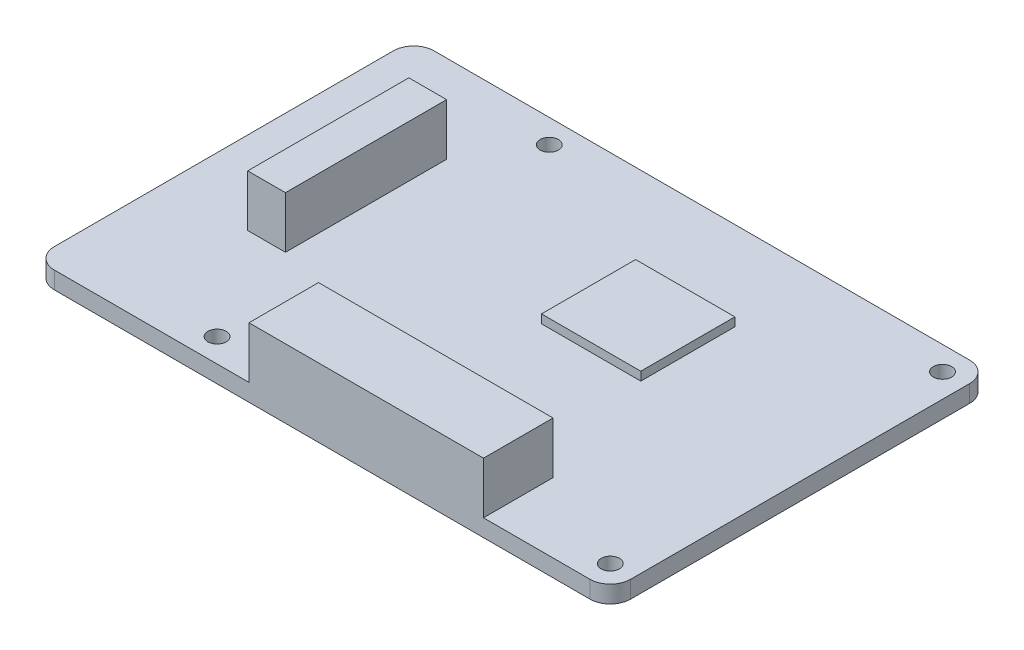
ISO-10303-21;
HEADER;
FILE_DESCRIPTION(('STEP AP214'),'2;1');
FILE_NAME('part.step','',(''),(''),'','','');
FILE_SCHEMA(('AUTOMOTIVE_DESIGN { 1 0 10303 214 1 1 1 1 }'));
ENDSEC;
DATA;
#1=APPLICATION_CONTEXT('core data for automotive mechanical design processes');
#2=APPLICATION_PROTOCOL_DEFINITION('international standard','automotive_design',2000,#1);
#3=PRODUCT_CONTEXT('',#1,'mechanical');
#4=PRODUCT('Part','Part','',(#3));
#5=PRODUCT_RELATED_PRODUCT_CATEGORY('part','',(#4));
#6=PRODUCT_DEFINITION_FORMATION('','',#4);
#7=PRODUCT_DEFINITION_CONTEXT('part definition',#1,'design');
#8=PRODUCT_DEFINITION('design','',#6,#7);
#9=PRODUCT_DEFINITION_SHAPE('','',#8);
#10=(LENGTH_UNIT() NAMED_UNIT(*) SI_UNIT(.MILLI.,.METRE.));
#11=(NAMED_UNIT(*) PLANE_ANGLE_UNIT() SI_UNIT($,.RADIAN.));
#12=(NAMED_UNIT(*) SI_UNIT($,.STERADIAN.) SOLID_ANGLE_UNIT());
#13=UNCERTAINTY_MEASURE_WITH_UNIT(LENGTH_MEASURE(1.E-05),#10,'distance_accuracy_value','');
#14=(GEOMETRIC_REPRESENTATION_CONTEXT(3) GLOBAL_UNCERTAINTY_ASSIGNED_CONTEXT((#13)) GLOBAL_UNIT_ASSIGNED_CONTEXT((#10,
#11,#12)) REPRESENTATION_CONTEXT('',''));
#15=CARTESIAN_POINT('',(0.,0.,0.));
#16=DIRECTION('',(0.,0.,1.));
#17=DIRECTION('',(1.,0.,0.));
#18=AXIS2_PLACEMENT_3D('',#15,#16,#17);
#19=CARTESIAN_POINT('',(0.,2.54,0.));
#20=DIRECTION('',(0.,1.,0.));
#21=DIRECTION('',(0.,0.,1.));
#22=AXIS2_PLACEMENT_3D('',#19,#20,#21);
#23=PLANE('',#22);
#24=DIRECTION('',(0.,0.,1.));
#25=VECTOR('',#24,1.);
#26=CARTESIAN_POINT('',(-10.7962541657116,2.54,17.7403283003059));
#27=LINE('',#26,#25);
#28=CARTESIAN_POINT('',(-10.7962541657116,2.54,17.7403283003059));
#29=VERTEX_POINT('',#28);
#30=CARTESIAN_POINT('',(-10.7962541657116,2.54,28.0000000000008));
#31=VERTEX_POINT('',#30);
#32=EDGE_CURVE('E230',#29,#31,#27,.T.);
#33=ORIENTED_EDGE('',*,*,#32,.F.);
#34=DIRECTION('',(-1.,0.,0.));
#35=VECTOR('',#34,1.);
#36=CARTESIAN_POINT('',(-10.7962541657116,2.54,17.7403283003059));
#37=LINE('',#36,#35);
#38=CARTESIAN_POINT('',(23.7946042341264,2.54,17.7403283003059));
#39=VERTEX_POINT('',#38);
#40=EDGE_CURVE('E235',#39,#29,#37,.T.);
#41=ORIENTED_EDGE('',*,*,#40,.F.);
#42=DIRECTION('',(0.,0.,-1.));
#43=VECTOR('',#42,1.);
#44=CARTESIAN_POINT('',(23.7946042341264,2.54,17.7403283003059));
#45=LINE('',#44,#43);
#46=CARTESIAN_POINT('',(23.7946042341264,2.54,28.0000000000008));
#47=VERTEX_POINT('',#46);
#48=EDGE_CURVE('E244',#47,#39,#45,.T.);
#49=ORIENTED_EDGE('',*,*,#48,.F.);
#50=DIRECTION('',(1.,0.,0.));
#51=VECTOR('',#50,1.);
#52=CARTESIAN_POINT('',(0.,2.54,28.0000000000008));
#53=LINE('',#52,#51);
#54=CARTESIAN_POINT('',(39.5000022412256,2.54,28.0000000000008));
#55=VERTEX_POINT('',#54);
#56=EDGE_CURVE('E264',#47,#55,#53,.T.);
#57=ORIENTED_EDGE('',*,*,#56,.T.);
#58=CARTESIAN_POINT('',(39.5000022412256,2.54,25.0000022412256));
#59=DIRECTION('',(0.,1.,0.));
#60=DIRECTION('',(0.,0.,1.));
#61=AXIS2_PLACEMENT_3D('',#58,#59,#60);
#62=CIRCLE('',#61,2.99999775877525);
#63=CARTESIAN_POINT('',(42.5000000000008,2.54,25.0000022412256));
#64=VERTEX_POINT('',#63);
#65=EDGE_CURVE('E268',#55,#64,#62,.T.);
#66=ORIENTED_EDGE('',*,*,#65,.T.);
#67=DIRECTION('',(0.,0.,-1.));
#68=VECTOR('',#67,1.);
#69=CARTESIAN_POINT('',(42.5000000000008,2.54,0.));
#70=LINE('',#69,#68);
#71=CARTESIAN_POINT('',(42.5000000000008,2.54,-25.0000022412256));
#72=VERTEX_POINT('',#71);
#73=EDGE_CURVE('E270',#64,#72,#70,.T.);
#74=ORIENTED_EDGE('',*,*,#73,.T.);
#75=CARTESIAN_POINT('',(39.5000022412256,2.54,-25.0000022412256));
#76=DIRECTION('',(0.,1.,0.));
#77=DIRECTION('',(0.,0.,1.));
#78=AXIS2_PLACEMENT_3D('',#75,#76,#77);
#79=CIRCLE('',#78,2.99999775877525);
#80=CARTESIAN_POINT('',(39.5000022412256,2.54,-28.0000000000008));
#81=VERTEX_POINT('',#80);
#82=EDGE_CURVE('E272',#72,#81,#79,.T.);
#83=ORIENTED_EDGE('',*,*,#82,.T.);
#84=DIRECTION('',(-1.,0.,0.));
#85=VECTOR('',#84,1.);
#86=CARTESIAN_POINT('',(0.,2.54,-28.0000000000008));
#87=LINE('',#86,#85);
#88=CARTESIAN_POINT('',(-39.5000022412248,2.54,-28.0000000000008));
#89=VERTEX_POINT('',#88);
#90=EDGE_CURVE('E274',#81,#89,#87,.T.);
#91=ORIENTED_EDGE('',*,*,#90,.T.);
#92=CARTESIAN_POINT('',(-39.5000022412256,2.54,-25.0000022412256));
#93=DIRECTION('',(0.,1.,0.));
#94=DIRECTION('',(0.,0.,1.));
#95=AXIS2_PLACEMENT_3D('',#92,#93,#94);
#96=CIRCLE('',#95,2.99999775877482);
#97=CARTESIAN_POINT('',(-42.5,2.54,-25.0000022412256));
#98=VERTEX_POINT('',#97);
#99=EDGE_CURVE('E276',#89,#98,#96,.T.);
#100=ORIENTED_EDGE('',*,*,#99,.T.);
#101=DIRECTION('',(0.,0.,1.));
#102=VECTOR('',#101,1.);
#103=CARTESIAN_POINT('',(-42.5,2.54,0.));
#104=LINE('',#103,#102);
#105=CARTESIAN_POINT('',(-42.5,2.54,25.0000022412256));
#106=VERTEX_POINT('',#105);
#107=EDGE_CURVE('E278',#98,#106,#104,.T.);
#108=ORIENTED_EDGE('',*,*,#107,.T.);
#109=CARTESIAN_POINT('',(-39.5000022412256,2.54,25.0000022412256));
#110=DIRECTION('',(0.,1.,0.));
#111=DIRECTION('',(0.,0.,1.));
#112=AXIS2_PLACEMENT_3D('',#109,#110,#111);
#113=CIRCLE('',#112,2.99999775877482);
#114=CARTESIAN_POINT('',(-39.5000022412247,2.54,28.0000000000008));
#115=VERTEX_POINT('',#114);
#116=EDGE_CURVE('E280',#106,#115,#113,.T.);
#117=ORIENTED_EDGE('',*,*,#116,.T.);
#118=EDGE_CURVE('E266',#115,#31,#53,.T.);
#119=ORIENTED_EDGE('',*,*,#118,.T.);
#120=EDGE_LOOP('',(#33,#41,#49,#57,#66,#74,#83,#91,#100,#108,#117,#119));
#121=FACE_BOUND('',#120,.T.);
#122=CARTESIAN_POINT('',(-19.,2.54,24.5));
#123=DIRECTION('',(0.,1.,0.));
#124=DIRECTION('',(0.,0.,1.));
#125=AXIS2_PLACEMENT_3D('',#122,#123,#124);
#126=CIRCLE('',#125,1.35);
#127=CARTESIAN_POINT('',(-19.,2.54,25.85));
#128=VERTEX_POINT('',#127);
#129=EDGE_CURVE('E261',#128,#128,#126,.T.);
#130=ORIENTED_EDGE('',*,*,#129,.F.);
#131=EDGE_LOOP('',(#130));
#132=FACE_BOUND('',#131,.T.);
#133=CARTESIAN_POINT('',(39.,2.54,24.5));
#134=DIRECTION('',(0.,1.,0.));
#135=DIRECTION('',(0.,0.,1.));
#136=AXIS2_PLACEMENT_3D('',#133,#134,#135);
#137=CIRCLE('',#136,1.35000000000001);
#138=CARTESIAN_POINT('',(39.,2.54,25.85));
#139=VERTEX_POINT('',#138);
#140=EDGE_CURVE('E282',#139,#139,#137,.T.);
#141=ORIENTED_EDGE('',*,*,#140,.F.);
#142=EDGE_LOOP('',(#141));
#143=FACE_BOUND('',#142,.T.);
#144=CARTESIAN_POINT('',(-19.,2.54,-24.5));
#145=DIRECTION('',(0.,1.,0.));
#146=DIRECTION('',(0.,0.,1.));
#147=AXIS2_PLACEMENT_3D('',#144,#145,#146);
#148=CIRCLE('',#147,1.35);
#149=CARTESIAN_POINT('',(-19.,2.54,-23.15));
#150=VERTEX_POINT('',#149);
#151=EDGE_CURVE('E285',#150,#150,#148,.T.);
#152=ORIENTED_EDGE('',*,*,#151,.F.);
#153=EDGE_LOOP('',(#152));
#154=FACE_BOUND('',#153,.T.);
#155=CARTESIAN_POINT('',(39.,2.54,-24.5));
#156=DIRECTION('',(0.,1.,0.));
#157=DIRECTION('',(0.,0.,1.));
#158=AXIS2_PLACEMENT_3D('',#155,#156,#157);
#159=CIRCLE('',#158,1.35);
#160=CARTESIAN_POINT('',(39.,2.54,-23.15));
#161=VERTEX_POINT('',#160);
#162=EDGE_CURVE('E288',#161,#161,#159,.T.);
#163=ORIENTED_EDGE('',*,*,#162,.F.);
#164=EDGE_LOOP('',(#163));
#165=FACE_BOUND('',#164,.T.);
#166=DIRECTION('',(-1.,0.,0.));
#167=VECTOR('',#166,1.);
#168=CARTESIAN_POINT('',(-24.7209516078613,2.54,-15.0780354516087));
#169=LINE('',#168,#167);
#170=CARTESIAN_POINT('',(-24.7209516078613,2.54,-15.0780354516087));
#171=VERTEX_POINT('',#170);
#172=CARTESIAN_POINT('',(-30.2919367403547,2.54,-15.0780354516087));
#173=VERTEX_POINT('',#172);
#174=EDGE_CURVE('E202',#171,#173,#169,.T.);
#175=ORIENTED_EDGE('',*,*,#174,.F.);
#176=DIRECTION('',(0.,0.,-1.));
#177=VECTOR('',#176,1.);
#178=CARTESIAN_POINT('',(-24.7209516078613,2.54,-15.0780354516087));
#179=LINE('',#178,#177);
#180=CARTESIAN_POINT('',(-24.7209516078613,2.54,8.69120809727519));
#181=VERTEX_POINT('',#180);
#182=EDGE_CURVE('E199',#181,#171,#179,.T.);
#183=ORIENTED_EDGE('',*,*,#182,.F.);
#184=DIRECTION('',(1.,0.,0.));
#185=VECTOR('',#184,1.);
#186=CARTESIAN_POINT('',(-24.7209516078613,2.54,8.69120809727519));
#187=LINE('',#186,#185);
#188=CARTESIAN_POINT('',(-30.2919367403547,2.54,8.69120809727519));
#189=VERTEX_POINT('',#188);
#190=EDGE_CURVE('E211',#189,#181,#187,.T.);
#191=ORIENTED_EDGE('',*,*,#190,.F.);
#192=DIRECTION('',(0.,0.,1.));
#193=VECTOR('',#192,1.);
#194=CARTESIAN_POINT('',(-30.2919367403547,2.54,-15.0780354516087));
#195=LINE('',#194,#193);
#196=EDGE_CURVE('E219',#173,#189,#195,.T.);
#197=ORIENTED_EDGE('',*,*,#196,.F.);
#198=EDGE_LOOP('',(#175,#183,#191,#197));
#199=FACE_BOUND('',#198,.T.);
#200=DIRECTION('',(1.,0.,0.));
#201=VECTOR('',#200,1.);
#202=CARTESIAN_POINT('',(3.29664816990771,2.54,-1.05752520516944));
#203=LINE('',#202,#201);
#204=CARTESIAN_POINT('',(3.29664816990771,2.54,-1.05752520516944));
#205=VERTEX_POINT('',#204);
#206=CARTESIAN_POINT('',(17.9361310381978,2.54,-1.05752520516944));
#207=VERTEX_POINT('',#206);
#208=EDGE_CURVE('E436',#205,#207,#203,.T.);
#209=ORIENTED_EDGE('',*,*,#208,.F.);
#210=DIRECTION('',(0.,0.,1.));
#211=VECTOR('',#210,1.);
#212=CARTESIAN_POINT('',(3.29664816990771,2.54,-14.9369410089548));
#213=LINE('',#212,#211);
#214=CARTESIAN_POINT('',(3.29664816990771,2.54,-14.9369410089548));
#215=VERTEX_POINT('',#214);
#216=EDGE_CURVE('E197',#215,#205,#213,.T.);
#217=ORIENTED_EDGE('',*,*,#216,.F.);
#218=DIRECTION('',(-1.,0.,0.));
#219=VECTOR('',#218,1.);
#220=CARTESIAN_POINT('',(3.29664816990771,2.54,-14.9369410089548));
#221=LINE('',#220,#219);
#222=CARTESIAN_POINT('',(17.9361310381978,2.54,-14.9369410089548));
#223=VERTEX_POINT('',#222);
#224=EDGE_CURVE('E193',#223,#215,#221,.T.);
#225=ORIENTED_EDGE('',*,*,#224,.F.);
#226=DIRECTION('',(0.,0.,-1.));
#227=VECTOR('',#226,1.);
#228=CARTESIAN_POINT('',(17.9361310381978,2.54,-14.9369410089548));
#229=LINE('',#228,#227);
#230=EDGE_CURVE('E438',#207,#223,#229,.T.);
#231=ORIENTED_EDGE('',*,*,#230,.F.);
#232=EDGE_LOOP('',(#209,#217,#225,#231));
#233=FACE_BOUND('',#232,.T.);
#234=ADVANCED_FACE('F36',(#121,#132,#143,#154,#165,#199,#233),#23,.T.);
#235=CARTESIAN_POINT('',(0.,2.54,28.0000000000008));
#236=DIRECTION('',(0.,0.,-1.));
#237=DIRECTION('',(-1.,0.,0.));
#238=AXIS2_PLACEMENT_3D('',#235,#236,#237);
#239=PLANE('',#238);
#240=DIRECTION('',(1.,0.,0.));
#241=VECTOR('',#240,1.);
#242=CARTESIAN_POINT('',(0.,0.,28.0000000000008));
#243=LINE('',#242,#241);
#244=CARTESIAN_POINT('',(-39.5000022412247,0.,28.0000000000008));
#245=VERTEX_POINT('',#244);
#246=CARTESIAN_POINT('',(39.5000022412256,0.,28.0000000000008));
#247=VERTEX_POINT('',#246);
#248=EDGE_CURVE('E294',#245,#247,#243,.T.);
#249=ORIENTED_EDGE('',*,*,#248,.T.);
#250=DIRECTION('',(0.,-1.,0.));
#251=VECTOR('',#250,1.);
#252=CARTESIAN_POINT('',(39.5000022412256,2.54,28.0000000000008));
#253=LINE('',#252,#251);
#254=EDGE_CURVE('E11',#55,#247,#253,.T.);
#255=ORIENTED_EDGE('',*,*,#254,.F.);
#256=ORIENTED_EDGE('',*,*,#56,.F.);
#257=DIRECTION('',(0.,-1.,0.));
#258=VECTOR('',#257,1.);
#259=CARTESIAN_POINT('',(23.7946042341264,10.16,28.0000000000008));
#260=LINE('',#259,#258);
#261=CARTESIAN_POINT('',(23.7946042341264,10.16,28.0000000000008));
#262=VERTEX_POINT('',#261);
#263=EDGE_CURVE('E254',#262,#47,#260,.T.);
#264=ORIENTED_EDGE('',*,*,#263,.F.);
#265=DIRECTION('',(1.,0.,0.));
#266=VECTOR('',#265,1.);
#267=CARTESIAN_POINT('',(-10.7962541657116,10.16,28.0000000000008));
#268=LINE('',#267,#266);
#269=CARTESIAN_POINT('',(-10.7962541657116,10.16,28.0000000000008));
#270=VERTEX_POINT('',#269);
#271=EDGE_CURVE('E234',#270,#262,#268,.T.);
#272=ORIENTED_EDGE('',*,*,#271,.F.);
#273=DIRECTION('',(0.,-1.,0.));
#274=VECTOR('',#273,1.);
#275=CARTESIAN_POINT('',(-10.7962541657116,10.16,28.0000000000008));
#276=LINE('',#275,#274);
#277=EDGE_CURVE('E257',#270,#31,#276,.T.);
#278=ORIENTED_EDGE('',*,*,#277,.T.);
#279=ORIENTED_EDGE('',*,*,#118,.F.);
#280=DIRECTION('',(0.,-1.,0.));
#281=VECTOR('',#280,1.);
#282=CARTESIAN_POINT('',(-39.5000022412247,2.54,28.0000000000008));
#283=LINE('',#282,#281);
#284=EDGE_CURVE('E291',#115,#245,#283,.T.);
#285=ORIENTED_EDGE('',*,*,#284,.T.);
#286=EDGE_LOOP('',(#249,#255,#256,#264,#272,#278,#279,#285));
#287=FACE_BOUND('',#286,.T.);
#288=ADVANCED_FACE('F367',(#287),#239,.F.);
#289=CARTESIAN_POINT('',(39.5000022412256,2.54,25.0000022412256));
#290=DIRECTION('',(0.,-1.,0.));
#291=DIRECTION('',(0.,0.,-1.));
#292=AXIS2_PLACEMENT_3D('',#289,#290,#291);
#293=CYLINDRICAL_SURFACE('',#292,2.99999775877525);
#294=CARTESIAN_POINT('',(39.5000022412256,0.,25.0000022412256));
#295=DIRECTION('',(0.,1.,0.));
#296=DIRECTION('',(0.,0.,1.));
#297=AXIS2_PLACEMENT_3D('',#294,#295,#296);
#298=CIRCLE('',#297,2.99999775877525);
#299=CARTESIAN_POINT('',(42.5000000000008,0.,25.0000022412256));
#300=VERTEX_POINT('',#299);
#301=EDGE_CURVE('E297',#247,#300,#298,.T.);
#302=ORIENTED_EDGE('',*,*,#301,.T.);
#303=DIRECTION('',(0.,-1.,0.));
#304=VECTOR('',#303,1.);
#305=CARTESIAN_POINT('',(42.5000000000008,2.54,25.0000022412256));
#306=LINE('',#305,#304);
#307=EDGE_CURVE('E44',#64,#300,#306,.T.);
#308=ORIENTED_EDGE('',*,*,#307,.F.);
#309=ORIENTED_EDGE('',*,*,#65,.F.);
#310=ORIENTED_EDGE('',*,*,#254,.T.);
#311=EDGE_LOOP('',(#302,#308,#309,#310));
#312=FACE_BOUND('',#311,.T.);
#313=ADVANCED_FACE('F365',(#312),#293,.T.);
#314=CARTESIAN_POINT('',(42.5000000000008,2.54,0.));
#315=DIRECTION('',(-1.,0.,0.));
#316=DIRECTION('',(0.,0.,1.));
#317=AXIS2_PLACEMENT_3D('',#314,#315,#316);
#318=PLANE('',#317);
#319=DIRECTION('',(0.,0.,-1.));
#320=VECTOR('',#319,1.);
#321=CARTESIAN_POINT('',(42.5000000000008,0.,0.));
#322=LINE('',#321,#320);
#323=CARTESIAN_POINT('',(42.5000000000008,0.,-25.0000022412256));
#324=VERTEX_POINT('',#323);
#325=EDGE_CURVE('E299',#300,#324,#322,.T.);
#326=ORIENTED_EDGE('',*,*,#325,.T.);
#327=DIRECTION('',(0.,-1.,0.));
#328=VECTOR('',#327,1.);
#329=CARTESIAN_POINT('',(42.5000000000008,2.54,-25.0000022412256));
#330=LINE('',#329,#328);
#331=EDGE_CURVE('E333',#72,#324,#330,.T.);
#332=ORIENTED_EDGE('',*,*,#331,.F.);
#333=ORIENTED_EDGE('',*,*,#73,.F.);
#334=ORIENTED_EDGE('',*,*,#307,.T.);
#335=EDGE_LOOP('',(#326,#332,#333,#334));
#336=FACE_BOUND('',#335,.T.);
#337=ADVANCED_FACE('F340',(#336),#318,.F.);
#338=CARTESIAN_POINT('',(39.5000022412256,2.54,-25.0000022412256));
#339=DIRECTION('',(0.,-1.,0.));
#340=DIRECTION('',(0.,0.,-1.));
#341=AXIS2_PLACEMENT_3D('',#338,#339,#340);
#342=CYLINDRICAL_SURFACE('',#341,2.99999775877525);
#343=CARTESIAN_POINT('',(39.5000022412256,0.,-25.0000022412256));
#344=DIRECTION('',(0.,1.,0.));
#345=DIRECTION('',(0.,0.,1.));
#346=AXIS2_PLACEMENT_3D('',#343,#344,#345);
#347=CIRCLE('',#346,2.99999775877525);
#348=CARTESIAN_POINT('',(39.5000022412256,0.,-28.0000000000008));
#349=VERTEX_POINT('',#348);
#350=EDGE_CURVE('E301',#324,#349,#347,.T.);
#351=ORIENTED_EDGE('',*,*,#350,.T.);
#352=DIRECTION('',(0.,-1.,0.));
#353=VECTOR('',#352,1.);
#354=CARTESIAN_POINT('',(39.5000022412256,2.54,-28.0000000000008));
#355=LINE('',#354,#353);
#356=EDGE_CURVE('E330',#81,#349,#355,.T.);
#357=ORIENTED_EDGE('',*,*,#356,.F.);
#358=ORIENTED_EDGE('',*,*,#82,.F.);
#359=ORIENTED_EDGE('',*,*,#331,.T.);
#360=EDGE_LOOP('',(#351,#357,#358,#359));
#361=FACE_BOUND('',#360,.T.);
#362=ADVANCED_FACE('F353',(#361),#342,.T.);
#363=CARTESIAN_POINT('',(0.,2.54,-28.0000000000008));
#364=DIRECTION('',(0.,0.,1.));
#365=DIRECTION('',(1.,0.,0.));
#366=AXIS2_PLACEMENT_3D('',#363,#364,#365);
#367=PLANE('',#366);
#368=DIRECTION('',(-1.,0.,0.));
#369=VECTOR('',#368,1.);
#370=CARTESIAN_POINT('',(0.,0.,-28.0000000000008));
#371=LINE('',#370,#369);
#372=CARTESIAN_POINT('',(-39.5000022412248,0.,-28.0000000000008));
#373=VERTEX_POINT('',#372);
#374=EDGE_CURVE('E303',#349,#373,#371,.T.);
#375=ORIENTED_EDGE('',*,*,#374,.T.);
#376=DIRECTION('',(0.,-1.,0.));
#377=VECTOR('',#376,1.);
#378=CARTESIAN_POINT('',(-39.5000022412248,2.54,-28.0000000000008));
#379=LINE('',#378,#377);
#380=EDGE_CURVE('E327',#89,#373,#379,.T.);
#381=ORIENTED_EDGE('',*,*,#380,.F.);
#382=ORIENTED_EDGE('',*,*,#90,.F.);
#383=ORIENTED_EDGE('',*,*,#356,.T.);
#384=EDGE_LOOP('',(#375,#381,#382,#383));
#385=FACE_BOUND('',#384,.T.);
#386=ADVANCED_FACE('F357',(#385),#367,.F.);
#387=CARTESIAN_POINT('',(-39.5000022412256,2.54,-25.0000022412256));
#388=DIRECTION('',(0.,-1.,0.));
#389=DIRECTION('',(0.,0.,-1.));
#390=AXIS2_PLACEMENT_3D('',#387,#388,#389);
#391=CYLINDRICAL_SURFACE('',#390,2.99999775877482);
#392=CARTESIAN_POINT('',(-39.5000022412256,0.,-25.0000022412256));
#393=DIRECTION('',(0.,1.,0.));
#394=DIRECTION('',(0.,0.,1.));
#395=AXIS2_PLACEMENT_3D('',#392,#393,#394);
#396=CIRCLE('',#395,2.99999775877482);
#397=CARTESIAN_POINT('',(-42.5,0.,-25.0000022412256));
#398=VERTEX_POINT('',#397);
#399=EDGE_CURVE('E305',#373,#398,#396,.T.);
#400=ORIENTED_EDGE('',*,*,#399,.T.);
#401=DIRECTION('',(0.,-1.,0.));
#402=VECTOR('',#401,1.);
#403=CARTESIAN_POINT('',(-42.5,2.54,-25.0000022412256));
#404=LINE('',#403,#402);
#405=EDGE_CURVE('E324',#98,#398,#404,.T.);
#406=ORIENTED_EDGE('',*,*,#405,.F.);
#407=ORIENTED_EDGE('',*,*,#99,.F.);
#408=ORIENTED_EDGE('',*,*,#380,.T.);
#409=EDGE_LOOP('',(#400,#406,#407,#408));
#410=FACE_BOUND('',#409,.T.);
#411=ADVANCED_FACE('F381',(#410),#391,.T.);
#412=CARTESIAN_POINT('',(-42.5,2.54,0.));
#413=DIRECTION('',(1.,0.,0.));
#414=DIRECTION('',(0.,0.,-1.));
#415=AXIS2_PLACEMENT_3D('',#412,#413,#414);
#416=PLANE('',#415);
#417=DIRECTION('',(0.,0.,1.));
#418=VECTOR('',#417,1.);
#419=CARTESIAN_POINT('',(-42.5,0.,0.));
#420=LINE('',#419,#418);
#421=CARTESIAN_POINT('',(-42.5,0.,25.0000022412256));
#422=VERTEX_POINT('',#421);
#423=EDGE_CURVE('E307',#398,#422,#420,.T.);
#424=ORIENTED_EDGE('',*,*,#423,.T.);
#425=DIRECTION('',(0.,-1.,0.));
#426=VECTOR('',#425,1.);
#427=CARTESIAN_POINT('',(-42.5,2.54,25.0000022412256));
#428=LINE('',#427,#426);
#429=EDGE_CURVE('E321',#106,#422,#428,.T.);
#430=ORIENTED_EDGE('',*,*,#429,.F.);
#431=ORIENTED_EDGE('',*,*,#107,.F.);
#432=ORIENTED_EDGE('',*,*,#405,.T.);
#433=EDGE_LOOP('',(#424,#430,#431,#432));
#434=FACE_BOUND('',#433,.T.);
#435=ADVANCED_FACE('F379',(#434),#416,.F.);
#436=CARTESIAN_POINT('',(-19.,2.54,-24.5));
#437=DIRECTION('',(0.,-1.,0.));
#438=DIRECTION('',(0.,0.,-1.));
#439=AXIS2_PLACEMENT_3D('',#436,#437,#438);
#440=CYLINDRICAL_SURFACE('',#439,1.35);
#441=ORIENTED_EDGE('',*,*,#151,.T.);
#442=EDGE_LOOP('',(#441));
#443=FACE_BOUND('',#442,.T.);
#444=CARTESIAN_POINT('',(-19.,0.,-24.5));
#445=DIRECTION('',(0.,1.,0.));
#446=DIRECTION('',(0.,0.,1.));
#447=AXIS2_PLACEMENT_3D('',#444,#445,#446);
#448=CIRCLE('',#447,1.35);
#449=CARTESIAN_POINT('',(-19.,0.,-23.15));
#450=VERTEX_POINT('',#449);
#451=EDGE_CURVE('E314',#450,#450,#448,.T.);
#452=ORIENTED_EDGE('',*,*,#451,.F.);
#453=EDGE_LOOP('',(#452));
#454=FACE_BOUND('',#453,.T.);
#455=ADVANCED_FACE('F388',(#443,#454),#440,.F.);
#456=CARTESIAN_POINT('',(39.,2.54,24.5));
#457=DIRECTION('',(0.,-1.,0.));
#458=DIRECTION('',(0.,0.,-1.));
#459=AXIS2_PLACEMENT_3D('',#456,#457,#458);
#460=CYLINDRICAL_SURFACE('',#459,1.35000000000001);
#461=ORIENTED_EDGE('',*,*,#140,.T.);
#462=EDGE_LOOP('',(#461));
#463=FACE_BOUND('',#462,.T.);
#464=CARTESIAN_POINT('',(39.,0.,24.5));
#465=DIRECTION('',(0.,1.,0.));
#466=DIRECTION('',(0.,0.,1.));
#467=AXIS2_PLACEMENT_3D('',#464,#465,#466);
#468=CIRCLE('',#467,1.35000000000001);
#469=CARTESIAN_POINT('',(39.,0.,25.85));
#470=VERTEX_POINT('',#469);
#471=EDGE_CURVE('E311',#470,#470,#468,.T.);
#472=ORIENTED_EDGE('',*,*,#471,.F.);
#473=EDGE_LOOP('',(#472));
#474=FACE_BOUND('',#473,.T.);
#475=ADVANCED_FACE('F409',(#463,#474),#460,.F.);
#476=CARTESIAN_POINT('',(-39.5000022412256,2.54,25.0000022412256));
#477=DIRECTION('',(0.,-1.,0.));
#478=DIRECTION('',(0.,0.,-1.));
#479=AXIS2_PLACEMENT_3D('',#476,#477,#478);
#480=CYLINDRICAL_SURFACE('',#479,2.99999775877482);
#481=CARTESIAN_POINT('',(-39.5000022412256,0.,25.0000022412256));
#482=DIRECTION('',(0.,1.,0.));
#483=DIRECTION('',(0.,0.,1.));
#484=AXIS2_PLACEMENT_3D('',#481,#482,#483);
#485=CIRCLE('',#484,2.99999775877482);
#486=EDGE_CURVE('E309',#422,#245,#485,.T.);
#487=ORIENTED_EDGE('',*,*,#486,.T.);
#488=ORIENTED_EDGE('',*,*,#284,.F.);
#489=ORIENTED_EDGE('',*,*,#116,.F.);
#490=ORIENTED_EDGE('',*,*,#429,.T.);
#491=EDGE_LOOP('',(#487,#488,#489,#490));
#492=FACE_BOUND('',#491,.T.);
#493=ADVANCED_FACE('F374',(#492),#480,.T.);
#494=CARTESIAN_POINT('',(-19.,2.54,24.5));
#495=DIRECTION('',(0.,-1.,0.));
#496=DIRECTION('',(0.,0.,-1.));
#497=AXIS2_PLACEMENT_3D('',#494,#495,#496);
#498=CYLINDRICAL_SURFACE('',#497,1.35);
#499=ORIENTED_EDGE('',*,*,#129,.T.);
#500=EDGE_LOOP('',(#499));
#501=FACE_BOUND('',#500,.T.);
#502=CARTESIAN_POINT('',(-19.,0.,24.5));
#503=DIRECTION('',(0.,1.,0.));
#504=DIRECTION('',(0.,0.,1.));
#505=AXIS2_PLACEMENT_3D('',#502,#503,#504);
#506=CIRCLE('',#505,1.35);
#507=CARTESIAN_POINT('',(-19.,0.,25.85));
#508=VERTEX_POINT('',#507);
#509=EDGE_CURVE('E260',#508,#508,#506,.T.);
#510=ORIENTED_EDGE('',*,*,#509,.F.);
#511=EDGE_LOOP('',(#510));
#512=FACE_BOUND('',#511,.T.);
#513=ADVANCED_FACE('F38',(#501,#512),#498,.F.);
#514=CARTESIAN_POINT('',(39.,2.54,-24.5));
#515=DIRECTION('',(0.,-1.,0.));
#516=DIRECTION('',(0.,0.,-1.));
#517=AXIS2_PLACEMENT_3D('',#514,#515,#516);
#518=CYLINDRICAL_SURFACE('',#517,1.35);
#519=ORIENTED_EDGE('',*,*,#162,.T.);
#520=EDGE_LOOP('',(#519));
#521=FACE_BOUND('',#520,.T.);
#522=CARTESIAN_POINT('',(39.,0.,-24.5));
#523=DIRECTION('',(0.,1.,0.));
#524=DIRECTION('',(0.,0.,1.));
#525=AXIS2_PLACEMENT_3D('',#522,#523,#524);
#526=CIRCLE('',#525,1.35);
#527=CARTESIAN_POINT('',(39.,0.,-23.15));
#528=VERTEX_POINT('',#527);
#529=EDGE_CURVE('E265',#528,#528,#526,.T.);
#530=ORIENTED_EDGE('',*,*,#529,.F.);
#531=EDGE_LOOP('',(#530));
#532=FACE_BOUND('',#531,.T.);
#533=ADVANCED_FACE('F402',(#521,#532),#518,.F.);
#534=CARTESIAN_POINT('',(0.,0.,0.));
#535=DIRECTION('',(0.,1.,0.));
#536=DIRECTION('',(0.,0.,1.));
#537=AXIS2_PLACEMENT_3D('',#534,#535,#536);
#538=PLANE('',#537);
#539=ORIENTED_EDGE('',*,*,#509,.T.);
#540=EDGE_LOOP('',(#539));
#541=FACE_BOUND('',#540,.T.);
#542=ORIENTED_EDGE('',*,*,#248,.F.);
#543=ORIENTED_EDGE('',*,*,#486,.F.);
#544=ORIENTED_EDGE('',*,*,#423,.F.);
#545=ORIENTED_EDGE('',*,*,#399,.F.);
#546=ORIENTED_EDGE('',*,*,#374,.F.);
#547=ORIENTED_EDGE('',*,*,#350,.F.);
#548=ORIENTED_EDGE('',*,*,#325,.F.);
#549=ORIENTED_EDGE('',*,*,#301,.F.);
#550=EDGE_LOOP('',(#542,#543,#544,#545,#546,#547,#548,#549));
#551=FACE_BOUND('',#550,.T.);
#552=ORIENTED_EDGE('',*,*,#471,.T.);
#553=EDGE_LOOP('',(#552));
#554=FACE_BOUND('',#553,.T.);
#555=ORIENTED_EDGE('',*,*,#451,.T.);
#556=EDGE_LOOP('',(#555));
#557=FACE_BOUND('',#556,.T.);
#558=ORIENTED_EDGE('',*,*,#529,.T.);
#559=EDGE_LOOP('',(#558));
#560=FACE_BOUND('',#559,.T.);
#561=ADVANCED_FACE('F347',(#541,#551,#554,#557,#560),#538,.F.);
#562=CARTESIAN_POINT('',(-10.7962541657116,10.16,17.7403283003059));
#563=DIRECTION('',(1.,0.,0.));
#564=DIRECTION('',(0.,0.,-1.));
#565=AXIS2_PLACEMENT_3D('',#562,#563,#564);
#566=PLANE('',#565);
#567=ORIENTED_EDGE('',*,*,#32,.T.);
#568=ORIENTED_EDGE('',*,*,#277,.F.);
#569=DIRECTION('',(0.,0.,1.));
#570=VECTOR('',#569,1.);
#571=CARTESIAN_POINT('',(-10.7962541657116,10.16,17.7403283003059));
#572=LINE('',#571,#570);
#573=CARTESIAN_POINT('',(-10.7962541657116,10.16,17.7403283003059));
#574=VERTEX_POINT('',#573);
#575=EDGE_CURVE('E231',#574,#270,#572,.T.);
#576=ORIENTED_EDGE('',*,*,#575,.F.);
#577=DIRECTION('',(0.,-1.,0.));
#578=VECTOR('',#577,1.);
#579=CARTESIAN_POINT('',(-10.7962541657116,10.16,17.7403283003059));
#580=LINE('',#579,#578);
#581=EDGE_CURVE('E241',#574,#29,#580,.T.);
#582=ORIENTED_EDGE('',*,*,#581,.T.);
#583=EDGE_LOOP('',(#567,#568,#576,#582));
#584=FACE_BOUND('',#583,.T.);
#585=ADVANCED_FACE('F398',(#584),#566,.F.);
#586=CARTESIAN_POINT('',(23.7946042341264,10.16,17.7403283003059));
#587=DIRECTION('',(-1.,0.,0.));
#588=DIRECTION('',(0.,0.,1.));
#589=AXIS2_PLACEMENT_3D('',#586,#587,#588);
#590=PLANE('',#589);
#591=ORIENTED_EDGE('',*,*,#48,.T.);
#592=DIRECTION('',(0.,-1.,0.));
#593=VECTOR('',#592,1.);
#594=CARTESIAN_POINT('',(23.7946042341264,10.16,17.7403283003059));
#595=LINE('',#594,#593);
#596=CARTESIAN_POINT('',(23.7946042341264,10.16,17.7403283003059));
#597=VERTEX_POINT('',#596);
#598=EDGE_CURVE('E251',#597,#39,#595,.T.);
#599=ORIENTED_EDGE('',*,*,#598,.F.);
#600=DIRECTION('',(0.,0.,-1.));
#601=VECTOR('',#600,1.);
#602=CARTESIAN_POINT('',(23.7946042341264,10.16,17.7403283003059));
#603=LINE('',#602,#601);
#604=EDGE_CURVE('E237',#262,#597,#603,.T.);
#605=ORIENTED_EDGE('',*,*,#604,.F.);
#606=ORIENTED_EDGE('',*,*,#263,.T.);
#607=EDGE_LOOP('',(#591,#599,#605,#606));
#608=FACE_BOUND('',#607,.T.);
#609=ADVANCED_FACE('F488',(#608),#590,.F.);
#610=CARTESIAN_POINT('',(-10.7962541657116,10.16,17.7403283003059));
#611=DIRECTION('',(0.,0.,1.));
#612=DIRECTION('',(1.,0.,0.));
#613=AXIS2_PLACEMENT_3D('',#610,#611,#612);
#614=PLANE('',#613);
#615=ORIENTED_EDGE('',*,*,#40,.T.);
#616=ORIENTED_EDGE('',*,*,#581,.F.);
#617=DIRECTION('',(-1.,0.,0.));
#618=VECTOR('',#617,1.);
#619=CARTESIAN_POINT('',(-10.7962541657116,10.16,17.7403283003059));
#620=LINE('',#619,#618);
#621=EDGE_CURVE('E239',#597,#574,#620,.T.);
#622=ORIENTED_EDGE('',*,*,#621,.F.);
#623=ORIENTED_EDGE('',*,*,#598,.T.);
#624=EDGE_LOOP('',(#615,#616,#622,#623));
#625=FACE_BOUND('',#624,.T.);
#626=ADVANCED_FACE('F485',(#625),#614,.F.);
#627=CARTESIAN_POINT('',(0.,10.16,0.));
#628=DIRECTION('',(0.,1.,0.));
#629=DIRECTION('',(0.,0.,1.));
#630=AXIS2_PLACEMENT_3D('',#627,#628,#629);
#631=PLANE('',#630);
#632=ORIENTED_EDGE('',*,*,#575,.T.);
#633=ORIENTED_EDGE('',*,*,#271,.T.);
#634=ORIENTED_EDGE('',*,*,#604,.T.);
#635=ORIENTED_EDGE('',*,*,#621,.T.);
#636=EDGE_LOOP('',(#632,#633,#634,#635));
#637=FACE_BOUND('',#636,.T.);
#638=ADVANCED_FACE('F481',(#637),#631,.T.);
#639=CARTESIAN_POINT('',(-24.7209516078613,10.16,-15.0780354516087));
#640=DIRECTION('',(-1.,0.,0.));
#641=DIRECTION('',(0.,0.,1.));
#642=AXIS2_PLACEMENT_3D('',#639,#640,#641);
#643=PLANE('',#642);
#644=ORIENTED_EDGE('',*,*,#182,.T.);
#645=DIRECTION('',(0.,-1.,0.));
#646=VECTOR('',#645,1.);
#647=CARTESIAN_POINT('',(-24.7209516078613,10.16,-15.0780354516087));
#648=LINE('',#647,#646);
#649=CARTESIAN_POINT('',(-24.7209516078613,10.16,-15.0780354516087));
#650=VERTEX_POINT('',#649);
#651=EDGE_CURVE('E228',#650,#171,#648,.T.);
#652=ORIENTED_EDGE('',*,*,#651,.F.);
#653=DIRECTION('',(0.,0.,-1.));
#654=VECTOR('',#653,1.);
#655=CARTESIAN_POINT('',(-24.7209516078613,10.16,-15.0780354516087));
#656=LINE('',#655,#654);
#657=CARTESIAN_POINT('',(-24.7209516078613,10.16,8.69120809727519));
#658=VERTEX_POINT('',#657);
#659=EDGE_CURVE('E207',#658,#650,#656,.T.);
#660=ORIENTED_EDGE('',*,*,#659,.F.);
#661=DIRECTION('',(0.,-1.,0.));
#662=VECTOR('',#661,1.);
#663=CARTESIAN_POINT('',(-24.7209516078613,10.16,8.69120809727519));
#664=LINE('',#663,#662);
#665=EDGE_CURVE('E216',#658,#181,#664,.T.);
#666=ORIENTED_EDGE('',*,*,#665,.T.);
#667=EDGE_LOOP('',(#644,#652,#660,#666));
#668=FACE_BOUND('',#667,.T.);
#669=ADVANCED_FACE('F477',(#668),#643,.F.);
#670=CARTESIAN_POINT('',(-24.7209516078613,10.16,-15.0780354516087));
#671=DIRECTION('',(0.,0.,1.));
#672=DIRECTION('',(1.,0.,0.));
#673=AXIS2_PLACEMENT_3D('',#670,#671,#672);
#674=PLANE('',#673);
#675=ORIENTED_EDGE('',*,*,#174,.T.);
#676=DIRECTION('',(0.,-1.,0.));
#677=VECTOR('',#676,1.);
#678=CARTESIAN_POINT('',(-30.2919367403547,10.16,-15.0780354516087));
#679=LINE('',#678,#677);
#680=CARTESIAN_POINT('',(-30.2919367403547,10.16,-15.0780354516087));
#681=VERTEX_POINT('',#680);
#682=EDGE_CURVE('E225',#681,#173,#679,.T.);
#683=ORIENTED_EDGE('',*,*,#682,.F.);
#684=DIRECTION('',(-1.,0.,0.));
#685=VECTOR('',#684,1.);
#686=CARTESIAN_POINT('',(-24.7209516078613,10.16,-15.0780354516087));
#687=LINE('',#686,#685);
#688=EDGE_CURVE('E210',#650,#681,#687,.T.);
#689=ORIENTED_EDGE('',*,*,#688,.F.);
#690=ORIENTED_EDGE('',*,*,#651,.T.);
#691=EDGE_LOOP('',(#675,#683,#689,#690));
#692=FACE_BOUND('',#691,.T.);
#693=ADVANCED_FACE('F473',(#692),#674,.F.);
#694=CARTESIAN_POINT('',(-30.2919367403547,10.16,-15.0780354516087));
#695=DIRECTION('',(1.,0.,0.));
#696=DIRECTION('',(0.,0.,-1.));
#697=AXIS2_PLACEMENT_3D('',#694,#695,#696);
#698=PLANE('',#697);
#699=ORIENTED_EDGE('',*,*,#196,.T.);
#700=DIRECTION('',(0.,-1.,0.));
#701=VECTOR('',#700,1.);
#702=CARTESIAN_POINT('',(-30.2919367403547,10.16,8.69120809727519));
#703=LINE('',#702,#701);
#704=CARTESIAN_POINT('',(-30.2919367403547,10.16,8.69120809727519));
#705=VERTEX_POINT('',#704);
#706=EDGE_CURVE('E59',#705,#189,#703,.T.);
#707=ORIENTED_EDGE('',*,*,#706,.F.);
#708=DIRECTION('',(0.,0.,1.));
#709=VECTOR('',#708,1.);
#710=CARTESIAN_POINT('',(-30.2919367403547,10.16,-15.0780354516087));
#711=LINE('',#710,#709);
#712=EDGE_CURVE('E213',#681,#705,#711,.T.);
#713=ORIENTED_EDGE('',*,*,#712,.F.);
#714=ORIENTED_EDGE('',*,*,#682,.T.);
#715=EDGE_LOOP('',(#699,#707,#713,#714));
#716=FACE_BOUND('',#715,.T.);
#717=ADVANCED_FACE('F470',(#716),#698,.F.);
#718=CARTESIAN_POINT('',(-24.7209516078613,10.16,8.69120809727519));
#719=DIRECTION('',(0.,0.,-1.));
#720=DIRECTION('',(-1.,0.,0.));
#721=AXIS2_PLACEMENT_3D('',#718,#719,#720);
#722=PLANE('',#721);
#723=ORIENTED_EDGE('',*,*,#190,.T.);
#724=ORIENTED_EDGE('',*,*,#665,.F.);
#725=DIRECTION('',(1.,0.,0.));
#726=VECTOR('',#725,1.);
#727=CARTESIAN_POINT('',(-24.7209516078613,10.16,8.69120809727519));
#728=LINE('',#727,#726);
#729=EDGE_CURVE('E215',#705,#658,#728,.T.);
#730=ORIENTED_EDGE('',*,*,#729,.F.);
#731=ORIENTED_EDGE('',*,*,#706,.T.);
#732=EDGE_LOOP('',(#723,#724,#730,#731));
#733=FACE_BOUND('',#732,.T.);
#734=ADVANCED_FACE('F466',(#733),#722,.F.);
#735=CARTESIAN_POINT('',(0.,10.16,0.));
#736=DIRECTION('',(0.,-1.,0.));
#737=DIRECTION('',(0.,0.,-1.));
#738=AXIS2_PLACEMENT_3D('',#735,#736,#737);
#739=PLANE('',#738);
#740=ORIENTED_EDGE('',*,*,#659,.T.);
#741=ORIENTED_EDGE('',*,*,#688,.T.);
#742=ORIENTED_EDGE('',*,*,#712,.T.);
#743=ORIENTED_EDGE('',*,*,#729,.T.);
#744=EDGE_LOOP('',(#740,#741,#742,#743));
#745=FACE_BOUND('',#744,.T.);
#746=ADVANCED_FACE('F463',(#745),#739,.F.);
#747=CARTESIAN_POINT('',(3.29664816990771,3.81,-14.9369410089548));
#748=DIRECTION('',(1.,0.,0.));
#749=DIRECTION('',(0.,0.,-1.));
#750=AXIS2_PLACEMENT_3D('',#747,#748,#749);
#751=PLANE('',#750);
#752=ORIENTED_EDGE('',*,*,#216,.T.);
#753=DIRECTION('',(0.,-1.,0.));
#754=VECTOR('',#753,1.);
#755=CARTESIAN_POINT('',(3.29664816990771,3.81,-1.05752520516944));
#756=LINE('',#755,#754);
#757=CARTESIAN_POINT('',(3.29664816990771,3.81,-1.05752520516944));
#758=VERTEX_POINT('',#757);
#759=EDGE_CURVE('E178',#758,#205,#756,.T.);
#760=ORIENTED_EDGE('',*,*,#759,.F.);
#761=DIRECTION('',(0.,0.,1.));
#762=VECTOR('',#761,1.);
#763=CARTESIAN_POINT('',(3.29664816990771,3.81,-14.9369410089548));
#764=LINE('',#763,#762);
#765=CARTESIAN_POINT('',(3.29664816990771,3.81,-14.9369410089548));
#766=VERTEX_POINT('',#765);
#767=EDGE_CURVE('E185',#766,#758,#764,.T.);
#768=ORIENTED_EDGE('',*,*,#767,.F.);
#769=DIRECTION('',(0.,-1.,0.));
#770=VECTOR('',#769,1.);
#771=CARTESIAN_POINT('',(3.29664816990771,3.81,-14.9369410089548));
#772=LINE('',#771,#770);
#773=EDGE_CURVE('E445',#766,#215,#772,.T.);
#774=ORIENTED_EDGE('',*,*,#773,.T.);
#775=EDGE_LOOP('',(#752,#760,#768,#774));
#776=FACE_BOUND('',#775,.T.);
#777=ADVANCED_FACE('F195',(#776),#751,.F.);
#778=CARTESIAN_POINT('',(3.29664816990771,3.81,-1.05752520516944));
#779=DIRECTION('',(0.,0.,-1.));
#780=DIRECTION('',(-1.,0.,0.));
#781=AXIS2_PLACEMENT_3D('',#778,#779,#780);
#782=PLANE('',#781);
#783=ORIENTED_EDGE('',*,*,#208,.T.);
#784=DIRECTION('',(0.,-1.,0.));
#785=VECTOR('',#784,1.);
#786=CARTESIAN_POINT('',(17.9361310381978,3.81,-1.05752520516944));
#787=LINE('',#786,#785);
#788=CARTESIAN_POINT('',(17.9361310381978,3.81,-1.05752520516944));
#789=VERTEX_POINT('',#788);
#790=EDGE_CURVE('E181',#789,#207,#787,.T.);
#791=ORIENTED_EDGE('',*,*,#790,.F.);
#792=DIRECTION('',(1.,0.,0.));
#793=VECTOR('',#792,1.);
#794=CARTESIAN_POINT('',(3.29664816990771,3.81,-1.05752520516944));
#795=LINE('',#794,#793);
#796=EDGE_CURVE('E174',#758,#789,#795,.T.);
#797=ORIENTED_EDGE('',*,*,#796,.F.);
#798=ORIENTED_EDGE('',*,*,#759,.T.);
#799=EDGE_LOOP('',(#783,#791,#797,#798));
#800=FACE_BOUND('',#799,.T.);
#801=ADVANCED_FACE('F176',(#800),#782,.F.);
#802=CARTESIAN_POINT('',(17.9361310381978,3.81,-14.9369410089548));
#803=DIRECTION('',(-1.,0.,0.));
#804=DIRECTION('',(0.,0.,1.));
#805=AXIS2_PLACEMENT_3D('',#802,#803,#804);
#806=PLANE('',#805);
#807=ORIENTED_EDGE('',*,*,#230,.T.);
#808=DIRECTION('',(0.,-1.,0.));
#809=VECTOR('',#808,1.);
#810=CARTESIAN_POINT('',(17.9361310381978,3.81,-14.9369410089548));
#811=LINE('',#810,#809);
#812=CARTESIAN_POINT('',(17.9361310381978,3.81,-14.9369410089548));
#813=VERTEX_POINT('',#812);
#814=EDGE_CURVE('E51',#813,#223,#811,.T.);
#815=ORIENTED_EDGE('',*,*,#814,.F.);
#816=DIRECTION('',(0.,0.,-1.));
#817=VECTOR('',#816,1.);
#818=CARTESIAN_POINT('',(17.9361310381978,3.81,-14.9369410089548));
#819=LINE('',#818,#817);
#820=EDGE_CURVE('E184',#789,#813,#819,.T.);
#821=ORIENTED_EDGE('',*,*,#820,.F.);
#822=ORIENTED_EDGE('',*,*,#790,.T.);
#823=EDGE_LOOP('',(#807,#815,#821,#822));
#824=FACE_BOUND('',#823,.T.);
#825=ADVANCED_FACE('F448',(#824),#806,.F.);
#826=CARTESIAN_POINT('',(3.29664816990771,3.81,-14.9369410089548));
#827=DIRECTION('',(0.,0.,1.));
#828=DIRECTION('',(1.,0.,0.));
#829=AXIS2_PLACEMENT_3D('',#826,#827,#828);
#830=PLANE('',#829);
#831=ORIENTED_EDGE('',*,*,#224,.T.);
#832=ORIENTED_EDGE('',*,*,#773,.F.);
#833=DIRECTION('',(-1.,0.,0.));
#834=VECTOR('',#833,1.);
#835=CARTESIAN_POINT('',(3.29664816990771,3.81,-14.9369410089548));
#836=LINE('',#835,#834);
#837=EDGE_CURVE('E189',#813,#766,#836,.T.);
#838=ORIENTED_EDGE('',*,*,#837,.F.);
#839=ORIENTED_EDGE('',*,*,#814,.T.);
#840=EDGE_LOOP('',(#831,#832,#838,#839));
#841=FACE_BOUND('',#840,.T.);
#842=ADVANCED_FACE('F449',(#841),#830,.F.);
#843=CARTESIAN_POINT('',(0.,3.81,0.));
#844=DIRECTION('',(0.,1.,0.));
#845=DIRECTION('',(0.,0.,1.));
#846=AXIS2_PLACEMENT_3D('',#843,#844,#845);
#847=PLANE('',#846);
#848=ORIENTED_EDGE('',*,*,#767,.T.);
#849=ORIENTED_EDGE('',*,*,#796,.T.);
#850=ORIENTED_EDGE('',*,*,#820,.T.);
#851=ORIENTED_EDGE('',*,*,#837,.T.);
#852=EDGE_LOOP('',(#848,#849,#850,#851));
#853=FACE_BOUND('',#852,.T.);
#854=ADVANCED_FACE('F188',(#853),#847,.T.);
#855=CLOSED_SHELL('',(#234,#288,#313,#337,#362,#386,#411,#435,#455,#475,#493,#513,#533,#561,
#585,#609,#626,#638,#669,#693,#717,#734,#746,#777,#801,#825,#842,#854));
#856=MANIFOLD_SOLID_BREP('B2',#855);
#857=ADVANCED_BREP_SHAPE_REPRESENTATION('',(#18,#856),#14);
#858=SHAPE_DEFINITION_REPRESENTATION(#9,#857);
ENDSEC;
END-ISO-10303-21;
